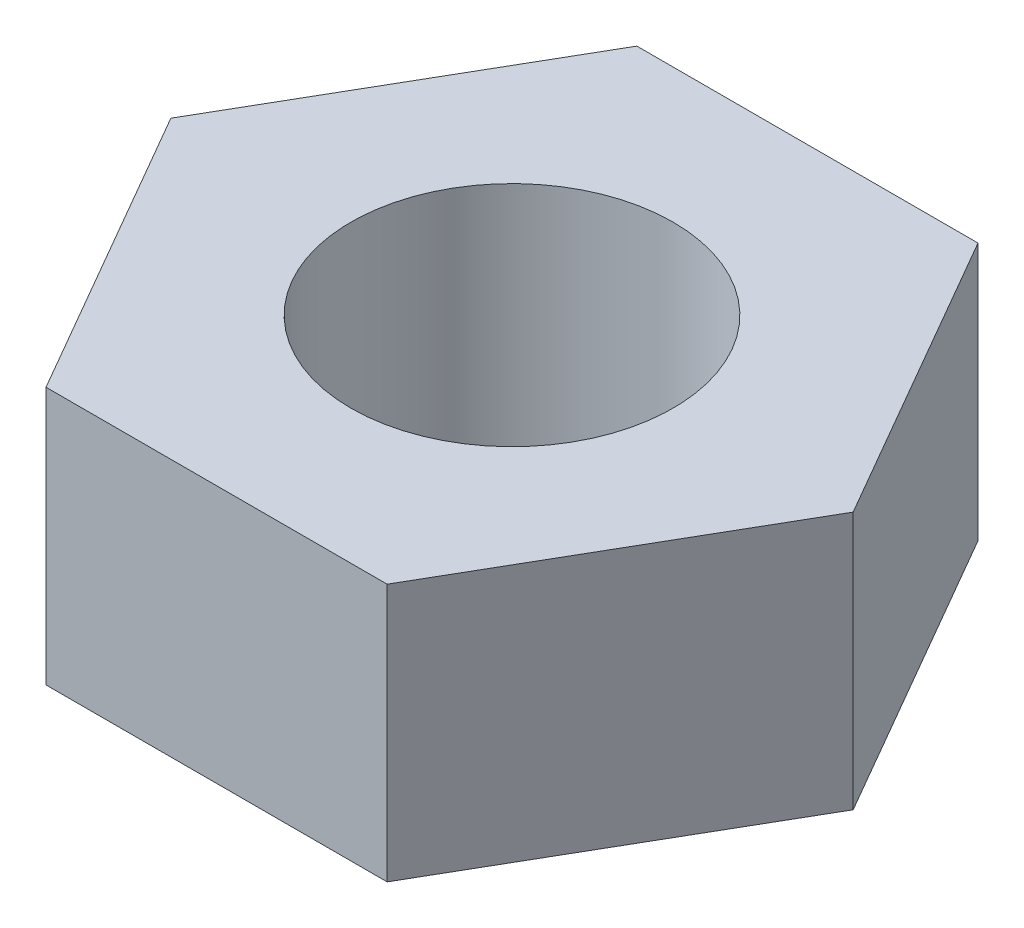
ISO-10303-21;
HEADER;
FILE_DESCRIPTION(('STEP AP214'),'2;1');
FILE_NAME('part.step','',(''),(''),'','','');
FILE_SCHEMA(('AUTOMOTIVE_DESIGN { 1 0 10303 214 1 1 1 1 }'));
ENDSEC;
DATA;
#1=APPLICATION_CONTEXT('core data for automotive mechanical design processes');
#2=APPLICATION_PROTOCOL_DEFINITION('international standard','automotive_design',2000,#1);
#3=PRODUCT_CONTEXT('',#1,'mechanical');
#4=PRODUCT('Part','Part','',(#3));
#5=PRODUCT_RELATED_PRODUCT_CATEGORY('part','',(#4));
#6=PRODUCT_DEFINITION_FORMATION('','',#4);
#7=PRODUCT_DEFINITION_CONTEXT('part definition',#1,'design');
#8=PRODUCT_DEFINITION('design','',#6,#7);
#9=PRODUCT_DEFINITION_SHAPE('','',#8);
#10=(LENGTH_UNIT() NAMED_UNIT(*) SI_UNIT(.MILLI.,.METRE.));
#11=(NAMED_UNIT(*) PLANE_ANGLE_UNIT() SI_UNIT($,.RADIAN.));
#12=(NAMED_UNIT(*) SI_UNIT($,.STERADIAN.) SOLID_ANGLE_UNIT());
#13=UNCERTAINTY_MEASURE_WITH_UNIT(LENGTH_MEASURE(1.E-05),#10,'distance_accuracy_value','');
#14=(GEOMETRIC_REPRESENTATION_CONTEXT(3) GLOBAL_UNCERTAINTY_ASSIGNED_CONTEXT((#13)) GLOBAL_UNIT_ASSIGNED_CONTEXT((#10,
#11,#12)) REPRESENTATION_CONTEXT('',''));
#15=CARTESIAN_POINT('',(0.,0.,0.));
#16=DIRECTION('',(0.,0.,1.));
#17=DIRECTION('',(1.,0.,0.));
#18=AXIS2_PLACEMENT_3D('',#15,#16,#17);
#19=CARTESIAN_POINT('',(0.,2.4,0.));
#20=DIRECTION('',(0.,1.,0.));
#21=DIRECTION('',(0.,0.,1.));
#22=AXIS2_PLACEMENT_3D('',#19,#20,#21);
#23=PLANE('',#22);
#24=DIRECTION('',(0.5,0.,-0.866025403784439));
#25=VECTOR('',#24,1.);
#26=CARTESIAN_POINT('',(1.58771324027151,2.4,2.75));
#27=LINE('',#26,#25);
#28=CARTESIAN_POINT('',(1.58771324027151,2.4,2.75));
#29=VERTEX_POINT('',#28);
#30=CARTESIAN_POINT('',(3.17542648054296,2.4,0.));
#31=VERTEX_POINT('',#30);
#32=EDGE_CURVE('E130',#29,#31,#27,.T.);
#33=ORIENTED_EDGE('',*,*,#32,.T.);
#34=DIRECTION('',(-0.499999999999999,0.,-0.866025403784439));
#35=VECTOR('',#34,1.);
#36=CARTESIAN_POINT('',(3.17542648054296,2.4,0.));
#37=LINE('',#36,#35);
#38=CARTESIAN_POINT('',(1.58771324027148,2.4,-2.75));
#39=VERTEX_POINT('',#38);
#40=EDGE_CURVE('E88',#31,#39,#37,.T.);
#41=ORIENTED_EDGE('',*,*,#40,.T.);
#42=DIRECTION('',(-1.,0.,0.));
#43=VECTOR('',#42,1.);
#44=CARTESIAN_POINT('',(1.58771324027148,2.4,-2.75));
#45=LINE('',#44,#43);
#46=CARTESIAN_POINT('',(-1.58771324027145,2.4,-2.75));
#47=VERTEX_POINT('',#46);
#48=EDGE_CURVE('E101',#39,#47,#45,.T.);
#49=ORIENTED_EDGE('',*,*,#48,.T.);
#50=DIRECTION('',(-0.5,0.,0.866025403784439));
#51=VECTOR('',#50,1.);
#52=CARTESIAN_POINT('',(-1.58771324027145,2.4,-2.75));
#53=LINE('',#52,#51);
#54=CARTESIAN_POINT('',(-3.17542648054292,2.4,0.));
#55=VERTEX_POINT('',#54);
#56=EDGE_CURVE('E95',#47,#55,#53,.T.);
#57=ORIENTED_EDGE('',*,*,#56,.T.);
#58=DIRECTION('',(0.5,0.,0.866025403784438));
#59=VECTOR('',#58,1.);
#60=CARTESIAN_POINT('',(-3.17542648054292,2.4,0.));
#61=LINE('',#60,#59);
#62=CARTESIAN_POINT('',(-1.58771324027145,2.4,2.75));
#63=VERTEX_POINT('',#62);
#64=EDGE_CURVE('E99',#55,#63,#61,.T.);
#65=ORIENTED_EDGE('',*,*,#64,.T.);
#66=DIRECTION('',(1.,0.,0.));
#67=VECTOR('',#66,1.);
#68=CARTESIAN_POINT('',(-1.58771324027145,2.4,2.75));
#69=LINE('',#68,#67);
#70=EDGE_CURVE('E51',#63,#29,#69,.T.);
#71=ORIENTED_EDGE('',*,*,#70,.T.);
#72=EDGE_LOOP('',(#33,#41,#49,#57,#65,#71));
#73=FACE_BOUND('',#72,.T.);
#74=CARTESIAN_POINT('',(0.,2.4,0.));
#75=DIRECTION('',(0.,1.,0.));
#76=DIRECTION('',(0.,0.,1.));
#77=AXIS2_PLACEMENT_3D('',#74,#75,#76);
#78=CIRCLE('',#77,1.5);
#79=CARTESIAN_POINT('',(0.,2.4,1.5));
#80=VERTEX_POINT('',#79);
#81=EDGE_CURVE('E123',#80,#80,#78,.T.);
#82=ORIENTED_EDGE('',*,*,#81,.F.);
#83=EDGE_LOOP('',(#82));
#84=FACE_BOUND('',#83,.T.);
#85=ADVANCED_FACE('F34',(#73,#84),#23,.T.);
#86=CARTESIAN_POINT('',(0.,0.,0.));
#87=DIRECTION('',(0.,1.,0.));
#88=DIRECTION('',(0.,0.,1.));
#89=AXIS2_PLACEMENT_3D('',#86,#87,#88);
#90=PLANE('',#89);
#91=DIRECTION('',(0.5,0.,-0.866025403784439));
#92=VECTOR('',#91,1.);
#93=CARTESIAN_POINT('',(1.58771324027151,0.,2.75));
#94=LINE('',#93,#92);
#95=CARTESIAN_POINT('',(1.58771324027151,0.,2.75));
#96=VERTEX_POINT('',#95);
#97=CARTESIAN_POINT('',(3.17542648054296,0.,0.));
#98=VERTEX_POINT('',#97);
#99=EDGE_CURVE('E119',#96,#98,#94,.T.);
#100=ORIENTED_EDGE('',*,*,#99,.F.);
#101=DIRECTION('',(1.,0.,0.));
#102=VECTOR('',#101,1.);
#103=CARTESIAN_POINT('',(-1.58771324027145,0.,2.75));
#104=LINE('',#103,#102);
#105=CARTESIAN_POINT('',(-1.58771324027145,0.,2.75));
#106=VERTEX_POINT('',#105);
#107=EDGE_CURVE('E80',#106,#96,#104,.T.);
#108=ORIENTED_EDGE('',*,*,#107,.F.);
#109=DIRECTION('',(0.5,0.,0.866025403784438));
#110=VECTOR('',#109,1.);
#111=CARTESIAN_POINT('',(-3.17542648054292,0.,0.));
#112=LINE('',#111,#110);
#113=CARTESIAN_POINT('',(-3.17542648054292,0.,0.));
#114=VERTEX_POINT('',#113);
#115=EDGE_CURVE('E74',#114,#106,#112,.T.);
#116=ORIENTED_EDGE('',*,*,#115,.F.);
#117=DIRECTION('',(-0.5,0.,0.866025403784439));
#118=VECTOR('',#117,1.);
#119=CARTESIAN_POINT('',(-1.58771324027145,0.,-2.75));
#120=LINE('',#119,#118);
#121=CARTESIAN_POINT('',(-1.58771324027145,0.,-2.75));
#122=VERTEX_POINT('',#121);
#123=EDGE_CURVE('E109',#122,#114,#120,.T.);
#124=ORIENTED_EDGE('',*,*,#123,.F.);
#125=DIRECTION('',(-1.,0.,0.));
#126=VECTOR('',#125,1.);
#127=CARTESIAN_POINT('',(1.58771324027148,0.,-2.75));
#128=LINE('',#127,#126);
#129=CARTESIAN_POINT('',(1.58771324027148,0.,-2.75));
#130=VERTEX_POINT('',#129);
#131=EDGE_CURVE('E125',#130,#122,#128,.T.);
#132=ORIENTED_EDGE('',*,*,#131,.F.);
#133=DIRECTION('',(-0.499999999999999,0.,-0.866025403784439));
#134=VECTOR('',#133,1.);
#135=CARTESIAN_POINT('',(3.17542648054296,0.,0.));
#136=LINE('',#135,#134);
#137=EDGE_CURVE('E122',#98,#130,#136,.T.);
#138=ORIENTED_EDGE('',*,*,#137,.F.);
#139=EDGE_LOOP('',(#100,#108,#116,#124,#132,#138));
#140=FACE_BOUND('',#139,.T.);
#141=CARTESIAN_POINT('',(0.,0.,0.));
#142=DIRECTION('',(0.,1.,0.));
#143=DIRECTION('',(0.,0.,1.));
#144=AXIS2_PLACEMENT_3D('',#141,#142,#143);
#145=CIRCLE('',#144,1.5);
#146=CARTESIAN_POINT('',(0.,0.,1.5));
#147=VERTEX_POINT('',#146);
#148=EDGE_CURVE('E223',#147,#147,#145,.T.);
#149=ORIENTED_EDGE('',*,*,#148,.T.);
#150=EDGE_LOOP('',(#149));
#151=FACE_BOUND('',#150,.T.);
#152=ADVANCED_FACE('F139',(#140,#151),#90,.F.);
#153=CARTESIAN_POINT('',(1.58771324027151,2.4,2.75));
#154=DIRECTION('',(-0.866025403784439,0.,-0.499999999999999));
#155=DIRECTION('',(-0.5,0.,0.866025403784439));
#156=AXIS2_PLACEMENT_3D('',#153,#154,#155);
#157=PLANE('',#156);
#158=ORIENTED_EDGE('',*,*,#99,.T.);
#159=DIRECTION('',(0.,-1.,0.));
#160=VECTOR('',#159,1.);
#161=CARTESIAN_POINT('',(3.17542648054296,2.4,0.));
#162=LINE('',#161,#160);
#163=EDGE_CURVE('E11',#31,#98,#162,.T.);
#164=ORIENTED_EDGE('',*,*,#163,.F.);
#165=ORIENTED_EDGE('',*,*,#32,.F.);
#166=DIRECTION('',(0.,-1.,0.));
#167=VECTOR('',#166,1.);
#168=CARTESIAN_POINT('',(1.58771324027151,2.4,2.75));
#169=LINE('',#168,#167);
#170=EDGE_CURVE('E115',#29,#96,#169,.T.);
#171=ORIENTED_EDGE('',*,*,#170,.T.);
#172=EDGE_LOOP('',(#158,#164,#165,#171));
#173=FACE_BOUND('',#172,.T.);
#174=ADVANCED_FACE('F36',(#173),#157,.F.);
#175=CARTESIAN_POINT('',(3.17542648054296,2.4,0.));
#176=DIRECTION('',(-0.866025403784439,0.,0.499999999999999));
#177=DIRECTION('',(0.499999999999999,0.,0.866025403784439));
#178=AXIS2_PLACEMENT_3D('',#175,#176,#177);
#179=PLANE('',#178);
#180=ORIENTED_EDGE('',*,*,#137,.T.);
#181=DIRECTION('',(0.,-1.,0.));
#182=VECTOR('',#181,1.);
#183=CARTESIAN_POINT('',(1.58771324027148,2.4,-2.75));
#184=LINE('',#183,#182);
#185=EDGE_CURVE('E43',#39,#130,#184,.T.);
#186=ORIENTED_EDGE('',*,*,#185,.F.);
#187=ORIENTED_EDGE('',*,*,#40,.F.);
#188=ORIENTED_EDGE('',*,*,#163,.T.);
#189=EDGE_LOOP('',(#180,#186,#187,#188));
#190=FACE_BOUND('',#189,.T.);
#191=ADVANCED_FACE('F164',(#190),#179,.F.);
#192=CARTESIAN_POINT('',(1.58771324027148,2.4,-2.75));
#193=DIRECTION('',(0.,0.,1.));
#194=DIRECTION('',(1.,0.,0.));
#195=AXIS2_PLACEMENT_3D('',#192,#193,#194);
#196=PLANE('',#195);
#197=ORIENTED_EDGE('',*,*,#131,.T.);
#198=DIRECTION('',(0.,-1.,0.));
#199=VECTOR('',#198,1.);
#200=CARTESIAN_POINT('',(-1.58771324027145,2.4,-2.75));
#201=LINE('',#200,#199);
#202=EDGE_CURVE('E110',#47,#122,#201,.T.);
#203=ORIENTED_EDGE('',*,*,#202,.F.);
#204=ORIENTED_EDGE('',*,*,#48,.F.);
#205=ORIENTED_EDGE('',*,*,#185,.T.);
#206=EDGE_LOOP('',(#197,#203,#204,#205));
#207=FACE_BOUND('',#206,.T.);
#208=ADVANCED_FACE('F136',(#207),#196,.F.);
#209=CARTESIAN_POINT('',(-1.58771324027145,2.4,-2.75));
#210=DIRECTION('',(0.866025403784439,0.,0.5));
#211=DIRECTION('',(0.5,0.,-0.866025403784439));
#212=AXIS2_PLACEMENT_3D('',#209,#210,#211);
#213=PLANE('',#212);
#214=ORIENTED_EDGE('',*,*,#123,.T.);
#215=DIRECTION('',(0.,-1.,0.));
#216=VECTOR('',#215,1.);
#217=CARTESIAN_POINT('',(-3.17542648054292,2.4,0.));
#218=LINE('',#217,#216);
#219=EDGE_CURVE('E106',#55,#114,#218,.T.);
#220=ORIENTED_EDGE('',*,*,#219,.F.);
#221=ORIENTED_EDGE('',*,*,#56,.F.);
#222=ORIENTED_EDGE('',*,*,#202,.T.);
#223=EDGE_LOOP('',(#214,#220,#221,#222));
#224=FACE_BOUND('',#223,.T.);
#225=ADVANCED_FACE('F107',(#224),#213,.F.);
#226=CARTESIAN_POINT('',(-3.17542648054292,2.4,0.));
#227=DIRECTION('',(0.866025403784438,0.,-0.5));
#228=DIRECTION('',(-0.5,0.,-0.866025403784438));
#229=AXIS2_PLACEMENT_3D('',#226,#227,#228);
#230=PLANE('',#229);
#231=ORIENTED_EDGE('',*,*,#115,.T.);
#232=DIRECTION('',(0.,-1.,0.));
#233=VECTOR('',#232,1.);
#234=CARTESIAN_POINT('',(-1.58771324027145,2.4,2.75));
#235=LINE('',#234,#233);
#236=EDGE_CURVE('E111',#63,#106,#235,.T.);
#237=ORIENTED_EDGE('',*,*,#236,.F.);
#238=ORIENTED_EDGE('',*,*,#64,.F.);
#239=ORIENTED_EDGE('',*,*,#219,.T.);
#240=EDGE_LOOP('',(#231,#237,#238,#239));
#241=FACE_BOUND('',#240,.T.);
#242=ADVANCED_FACE('F113',(#241),#230,.F.);
#243=CARTESIAN_POINT('',(-1.58771324027145,2.4,2.75));
#244=DIRECTION('',(0.,0.,-1.));
#245=DIRECTION('',(-1.,0.,0.));
#246=AXIS2_PLACEMENT_3D('',#243,#244,#245);
#247=PLANE('',#246);
#248=ORIENTED_EDGE('',*,*,#107,.T.);
#249=ORIENTED_EDGE('',*,*,#170,.F.);
#250=ORIENTED_EDGE('',*,*,#70,.F.);
#251=ORIENTED_EDGE('',*,*,#236,.T.);
#252=EDGE_LOOP('',(#248,#249,#250,#251));
#253=FACE_BOUND('',#252,.T.);
#254=ADVANCED_FACE('F144',(#253),#247,.F.);
#255=CARTESIAN_POINT('',(0.,2.4,0.));
#256=DIRECTION('',(0.,-1.,0.));
#257=DIRECTION('',(0.,0.,-1.));
#258=AXIS2_PLACEMENT_3D('',#255,#256,#257);
#259=CYLINDRICAL_SURFACE('',#258,1.5);
#260=ORIENTED_EDGE('',*,*,#81,.T.);
#261=EDGE_LOOP('',(#260));
#262=FACE_BOUND('',#261,.T.);
#263=ORIENTED_EDGE('',*,*,#148,.F.);
#264=EDGE_LOOP('',(#263));
#265=FACE_BOUND('',#264,.T.);
#266=ADVANCED_FACE('F146',(#262,#265),#259,.F.);
#267=CLOSED_SHELL('',(#85,#152,#174,#191,#208,#225,#242,#254,#266));
#268=MANIFOLD_SOLID_BREP('B2',#267);
#269=ADVANCED_BREP_SHAPE_REPRESENTATION('',(#18,#268),#14);
#270=SHAPE_DEFINITION_REPRESENTATION(#9,#269);
ENDSEC;
END-ISO-10303-21;
